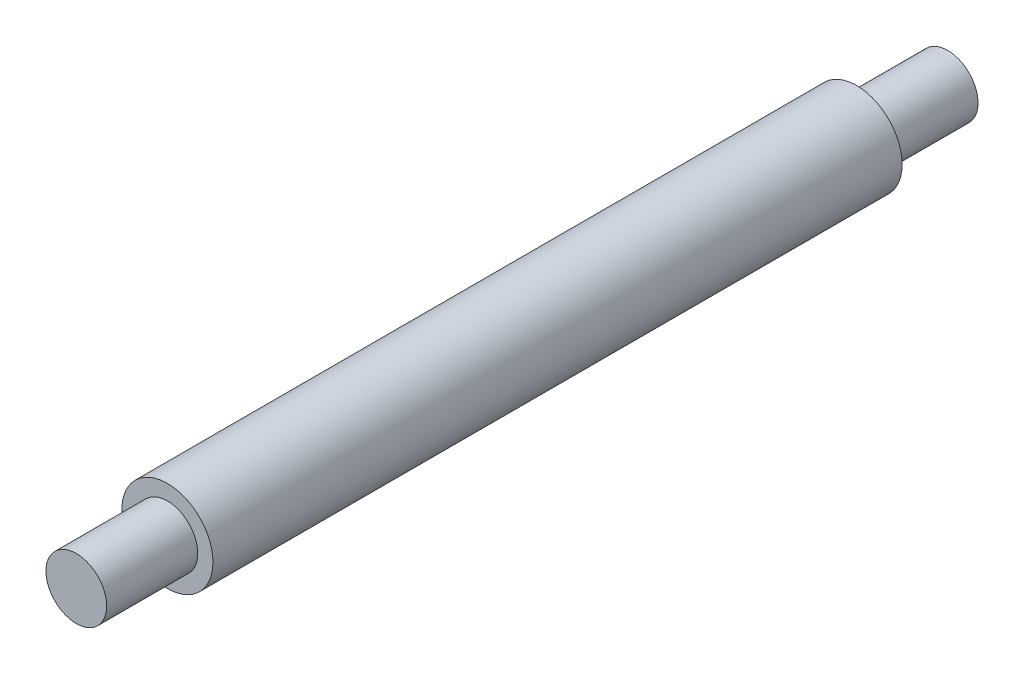
ISO-10303-21;
HEADER;
FILE_DESCRIPTION(('STEP AP214'),'2;1');
FILE_NAME('part.step','',(''),(''),'','','');
FILE_SCHEMA(('AUTOMOTIVE_DESIGN { 1 0 10303 214 1 1 1 1 }'));
ENDSEC;
DATA;
#1=APPLICATION_CONTEXT('core data for automotive mechanical design processes');
#2=APPLICATION_PROTOCOL_DEFINITION('international standard','automotive_design',2000,#1);
#3=PRODUCT_CONTEXT('',#1,'mechanical');
#4=PRODUCT('Part','Part','',(#3));
#5=PRODUCT_RELATED_PRODUCT_CATEGORY('part','',(#4));
#6=PRODUCT_DEFINITION_FORMATION('','',#4);
#7=PRODUCT_DEFINITION_CONTEXT('part definition',#1,'design');
#8=PRODUCT_DEFINITION('design','',#6,#7);
#9=PRODUCT_DEFINITION_SHAPE('','',#8);
#10=(LENGTH_UNIT() NAMED_UNIT(*) SI_UNIT(.MILLI.,.METRE.));
#11=(NAMED_UNIT(*) PLANE_ANGLE_UNIT() SI_UNIT($,.RADIAN.));
#12=(NAMED_UNIT(*) SI_UNIT($,.STERADIAN.) SOLID_ANGLE_UNIT());
#13=UNCERTAINTY_MEASURE_WITH_UNIT(LENGTH_MEASURE(1.E-05),#10,'distance_accuracy_value','');
#14=(GEOMETRIC_REPRESENTATION_CONTEXT(3) GLOBAL_UNCERTAINTY_ASSIGNED_CONTEXT((#13)) GLOBAL_UNIT_ASSIGNED_CONTEXT((#10,
#11,#12)) REPRESENTATION_CONTEXT('',''));
#15=CARTESIAN_POINT('',(0.,0.,0.));
#16=DIRECTION('',(0.,0.,1.));
#17=DIRECTION('',(1.,0.,0.));
#18=AXIS2_PLACEMENT_3D('',#15,#16,#17);
#19=CARTESIAN_POINT('',(0.,0.,22.7));
#20=DIRECTION('',(0.,0.,-1.));
#21=DIRECTION('',(-1.,0.,0.));
#22=AXIS2_PLACEMENT_3D('',#19,#20,#21);
#23=CYLINDRICAL_SURFACE('',#22,1.5);
#24=CARTESIAN_POINT('',(0.,0.,22.7));
#25=DIRECTION('',(0.,0.,1.));
#26=DIRECTION('',(1.,0.,0.));
#27=AXIS2_PLACEMENT_3D('',#24,#25,#26);
#28=CIRCLE('',#27,1.5);
#29=CARTESIAN_POINT('',(1.5,0.,22.7));
#30=VERTEX_POINT('',#29);
#31=EDGE_CURVE('E44',#30,#30,#28,.T.);
#32=ORIENTED_EDGE('',*,*,#31,.F.);
#33=EDGE_LOOP('',(#32));
#34=FACE_BOUND('',#33,.T.);
#35=CARTESIAN_POINT('',(0.,0.,0.));
#36=DIRECTION('',(0.,0.,1.));
#37=DIRECTION('',(1.,0.,0.));
#38=AXIS2_PLACEMENT_3D('',#35,#36,#37);
#39=CIRCLE('',#38,1.5);
#40=CARTESIAN_POINT('',(1.5,0.,0.));
#41=VERTEX_POINT('',#40);
#42=EDGE_CURVE('E35',#41,#41,#39,.T.);
#43=ORIENTED_EDGE('',*,*,#42,.T.);
#44=EDGE_LOOP('',(#43));
#45=FACE_BOUND('',#44,.T.);
#46=ADVANCED_FACE('F32',(#34,#45),#23,.T.);
#47=CARTESIAN_POINT('',(0.,0.,22.7));
#48=DIRECTION('',(0.,0.,1.));
#49=DIRECTION('',(1.,0.,0.));
#50=AXIS2_PLACEMENT_3D('',#47,#48,#49);
#51=PLANE('',#50);
#52=CARTESIAN_POINT('',(0.,0.,22.7));
#53=DIRECTION('',(0.,0.,1.));
#54=DIRECTION('',(1.,0.,0.));
#55=AXIS2_PLACEMENT_3D('',#52,#53,#54);
#56=CIRCLE('',#55,1.);
#57=CARTESIAN_POINT('',(1.,0.,22.7));
#58=VERTEX_POINT('',#57);
#59=EDGE_CURVE('E10',#58,#58,#56,.T.);
#60=ORIENTED_EDGE('',*,*,#59,.F.);
#61=EDGE_LOOP('',(#60));
#62=FACE_BOUND('',#61,.T.);
#63=ORIENTED_EDGE('',*,*,#31,.T.);
#64=EDGE_LOOP('',(#63));
#65=FACE_BOUND('',#64,.T.);
#66=ADVANCED_FACE('F61',(#62,#65),#51,.T.);
#67=CARTESIAN_POINT('',(0.,0.,0.));
#68=DIRECTION('',(0.,0.,1.));
#69=DIRECTION('',(1.,0.,0.));
#70=AXIS2_PLACEMENT_3D('',#67,#68,#69);
#71=PLANE('',#70);
#72=CARTESIAN_POINT('',(0.,0.,0.));
#73=DIRECTION('',(0.,0.,-1.));
#74=DIRECTION('',(-1.,0.,0.));
#75=AXIS2_PLACEMENT_3D('',#72,#73,#74);
#76=CIRCLE('',#75,1.);
#77=CARTESIAN_POINT('',(-1.,0.,0.));
#78=VERTEX_POINT('',#77);
#79=EDGE_CURVE('E39',#78,#78,#76,.T.);
#80=ORIENTED_EDGE('',*,*,#79,.F.);
#81=EDGE_LOOP('',(#80));
#82=FACE_BOUND('',#81,.T.);
#83=ORIENTED_EDGE('',*,*,#42,.F.);
#84=EDGE_LOOP('',(#83));
#85=FACE_BOUND('',#84,.T.);
#86=ADVANCED_FACE('F58',(#82,#85),#71,.F.);
#87=CARTESIAN_POINT('',(0.,0.,-3.));
#88=DIRECTION('',(0.,0.,1.));
#89=DIRECTION('',(1.,0.,0.));
#90=AXIS2_PLACEMENT_3D('',#87,#88,#89);
#91=CYLINDRICAL_SURFACE('',#90,1.);
#92=CARTESIAN_POINT('',(0.,0.,-3.));
#93=DIRECTION('',(0.,0.,-1.));
#94=DIRECTION('',(-1.,0.,0.));
#95=AXIS2_PLACEMENT_3D('',#92,#93,#94);
#96=CIRCLE('',#95,1.);
#97=CARTESIAN_POINT('',(-1.,0.,-3.));
#98=VERTEX_POINT('',#97);
#99=EDGE_CURVE('E49',#98,#98,#96,.T.);
#100=ORIENTED_EDGE('',*,*,#99,.F.);
#101=EDGE_LOOP('',(#100));
#102=FACE_BOUND('',#101,.T.);
#103=ORIENTED_EDGE('',*,*,#79,.T.);
#104=EDGE_LOOP('',(#103));
#105=FACE_BOUND('',#104,.T.);
#106=ADVANCED_FACE('F60',(#102,#105),#91,.T.);
#107=CARTESIAN_POINT('',(0.,0.,-3.));
#108=DIRECTION('',(0.,0.,-1.));
#109=DIRECTION('',(-1.,0.,0.));
#110=AXIS2_PLACEMENT_3D('',#107,#108,#109);
#111=PLANE('',#110);
#112=ORIENTED_EDGE('',*,*,#99,.T.);
#113=EDGE_LOOP('',(#112));
#114=FACE_BOUND('',#113,.T.);
#115=ADVANCED_FACE('F67',(#114),#111,.T.);
#116=CARTESIAN_POINT('',(0.,0.,25.7));
#117=DIRECTION('',(0.,0.,-1.));
#118=DIRECTION('',(-1.,0.,0.));
#119=AXIS2_PLACEMENT_3D('',#116,#117,#118);
#120=CYLINDRICAL_SURFACE('',#119,1.);
#121=CARTESIAN_POINT('',(0.,0.,25.7));
#122=DIRECTION('',(0.,0.,1.));
#123=DIRECTION('',(1.,0.,0.));
#124=AXIS2_PLACEMENT_3D('',#121,#122,#123);
#125=CIRCLE('',#124,1.);
#126=CARTESIAN_POINT('',(1.,0.,25.7));
#127=VERTEX_POINT('',#126);
#128=EDGE_CURVE('E48',#127,#127,#125,.T.);
#129=ORIENTED_EDGE('',*,*,#128,.F.);
#130=EDGE_LOOP('',(#129));
#131=FACE_BOUND('',#130,.T.);
#132=ORIENTED_EDGE('',*,*,#59,.T.);
#133=EDGE_LOOP('',(#132));
#134=FACE_BOUND('',#133,.T.);
#135=ADVANCED_FACE('F92',(#131,#134),#120,.T.);
#136=CARTESIAN_POINT('',(0.,0.,25.7));
#137=DIRECTION('',(0.,0.,1.));
#138=DIRECTION('',(1.,0.,0.));
#139=AXIS2_PLACEMENT_3D('',#136,#137,#138);
#140=PLANE('',#139);
#141=ORIENTED_EDGE('',*,*,#128,.T.);
#142=EDGE_LOOP('',(#141));
#143=FACE_BOUND('',#142,.T.);
#144=ADVANCED_FACE('F97',(#143),#140,.T.);
#145=CLOSED_SHELL('',(#46,#66,#86,#106,#115,#135,#144));
#146=MANIFOLD_SOLID_BREP('B2',#145);
#147=ADVANCED_BREP_SHAPE_REPRESENTATION('',(#18,#146),#14);
#148=SHAPE_DEFINITION_REPRESENTATION(#9,#147);
ENDSEC;
END-ISO-10303-21;
